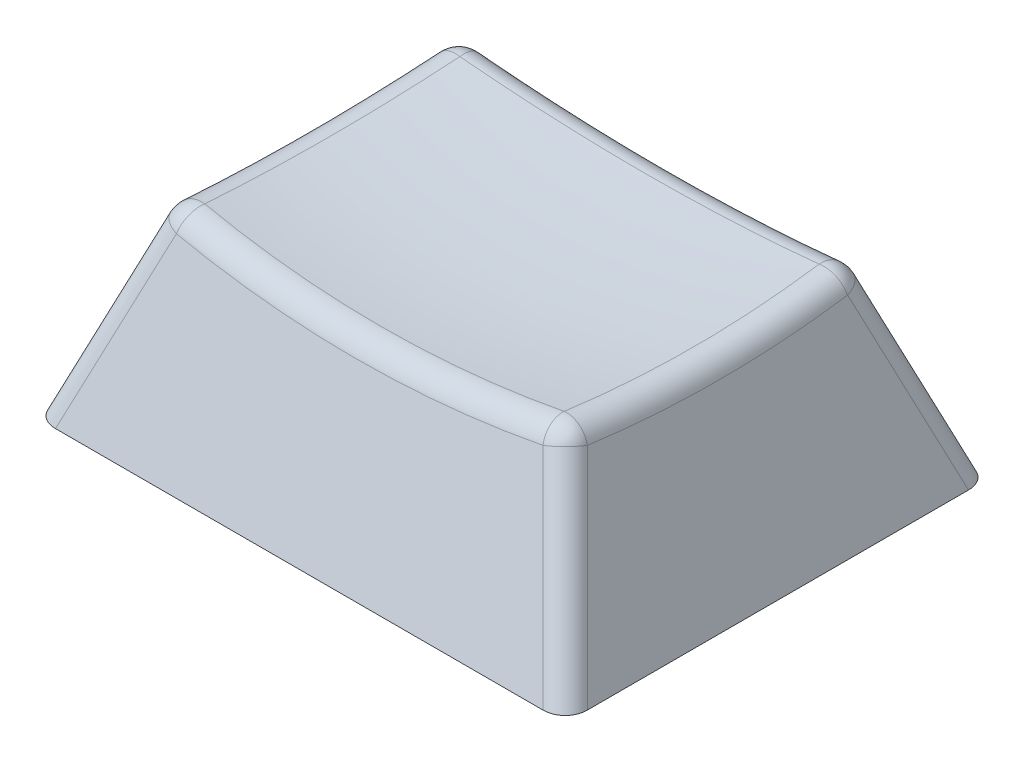
ISO-10303-21;
HEADER;
FILE_DESCRIPTION(('STEP AP214'),'2;1');
FILE_NAME('part.step','',(''),(''),'','','');
FILE_SCHEMA(('AUTOMOTIVE_DESIGN { 1 0 10303 214 1 1 1 1 }'));
ENDSEC;
DATA;
#1=APPLICATION_CONTEXT('core data for automotive mechanical design processes');
#2=APPLICATION_PROTOCOL_DEFINITION('international standard','automotive_design',2000,#1);
#3=PRODUCT_CONTEXT('',#1,'mechanical');
#4=PRODUCT('Part','Part','',(#3));
#5=PRODUCT_RELATED_PRODUCT_CATEGORY('part','',(#4));
#6=PRODUCT_DEFINITION_FORMATION('','',#4);
#7=PRODUCT_DEFINITION_CONTEXT('part definition',#1,'design');
#8=PRODUCT_DEFINITION('design','',#6,#7);
#9=PRODUCT_DEFINITION_SHAPE('','',#8);
#10=(LENGTH_UNIT() NAMED_UNIT(*) SI_UNIT(.MILLI.,.METRE.));
#11=(NAMED_UNIT(*) PLANE_ANGLE_UNIT() SI_UNIT($,.RADIAN.));
#12=(NAMED_UNIT(*) SI_UNIT($,.STERADIAN.) SOLID_ANGLE_UNIT());
#13=UNCERTAINTY_MEASURE_WITH_UNIT(LENGTH_MEASURE(1.E-05),#10,'distance_accuracy_value','');
#14=(GEOMETRIC_REPRESENTATION_CONTEXT(3) GLOBAL_UNCERTAINTY_ASSIGNED_CONTEXT((#13)) GLOBAL_UNIT_ASSIGNED_CONTEXT((#10,
#11,#12)) REPRESENTATION_CONTEXT('',''));
#15=CARTESIAN_POINT('',(0.,0.,0.));
#16=DIRECTION('',(0.,0.,1.));
#17=DIRECTION('',(1.,0.,0.));
#18=AXIS2_PLACEMENT_3D('',#15,#16,#17);
#19=CARTESIAN_POINT('',(-11.25,0.,9.));
#20=DIRECTION('',(-0.941470544812038,0.337095258423083,0.));
#21=DIRECTION('',(-0.337095258423083,-0.941470544812038,0.));
#22=AXIS2_PLACEMENT_3D('',#19,#20,#21);
#23=PLANE('',#22);
#24=DIRECTION('',(0.,0.,1.));
#25=VECTOR('',#24,1.);
#26=CARTESIAN_POINT('',(-11.25,0.,9.));
#27=LINE('',#26,#25);
#28=CARTESIAN_POINT('',(-11.25,0.,-8.05852945518796));
#29=VERTEX_POINT('',#28);
#30=CARTESIAN_POINT('',(-11.25,0.,8.05852945518796));
#31=VERTEX_POINT('',#30);
#32=EDGE_CURVE('E265',#29,#31,#27,.T.);
#33=ORIENTED_EDGE('',*,*,#32,.T.);
#34=DIRECTION('',(0.31943430634042,0.892145418564502,-0.31943430634042));
#35=VECTOR('',#34,1.);
#36=CARTESIAN_POINT('',(-11.3460660313607,-0.268302020343255,8.15459548654862));
#37=LINE('',#36,#35);
#38=CARTESIAN_POINT('',(-8.6937308781981,7.1393827787648,5.50226033338606));
#39=VERTEX_POINT('',#38);
#40=EDGE_CURVE('E297',#31,#39,#37,.T.);
#41=ORIENTED_EDGE('',*,*,#40,.T.);
#42=CARTESIAN_POINT('',(8.08913871573148,54.0121197434456,0.));
#43=DIRECTION('',(-0.941470544812038,0.337095258423083,0.));
#44=DIRECTION('',(-0.337095258423083,-0.941470544812038,0.));
#45=AXIS2_PLACEMENT_3D('',#42,#43,#44);
#46=CIRCLE('',#45,50.089849781601);
#47=CARTESIAN_POINT('',(-8.6937308781981,7.1393827787648,-5.50226033338606));
#48=VERTEX_POINT('',#47);
#49=EDGE_CURVE('E293',#39,#48,#46,.F.);
#50=ORIENTED_EDGE('',*,*,#49,.T.);
#51=DIRECTION('',(0.31943430634042,0.892145418564502,0.31943430634042));
#52=VECTOR('',#51,1.);
#53=CARTESIAN_POINT('',(-9.50937706215132,4.86137133246757,-6.31790651733928));
#54=LINE('',#53,#52);
#55=EDGE_CURVE('E295',#48,#29,#54,.F.);
#56=ORIENTED_EDGE('',*,*,#55,.T.);
#57=EDGE_LOOP('',(#33,#41,#50,#56));
#58=FACE_BOUND('',#57,.T.);
#59=ADVANCED_FACE('F35',(#58),#23,.T.);
#60=CARTESIAN_POINT('',(11.25,0.,9.));
#61=DIRECTION('',(0.,0.337095258423083,0.941470544812038));
#62=DIRECTION('',(0.,-0.941470544812038,0.337095258423083));
#63=AXIS2_PLACEMENT_3D('',#60,#61,#62);
#64=PLANE('',#63);
#65=CARTESIAN_POINT('',(0.,53.2980479160931,-10.083463985916));
#66=DIRECTION('',(0.,0.337095258423083,0.941470544812038));
#67=DIRECTION('',(0.,-0.941470544812038,0.337095258423083));
#68=AXIS2_PLACEMENT_3D('',#65,#66,#67);
#69=CIRCLE('',#68,49.6373657400651);
#70=CARTESIAN_POINT('',(7.75226033338606,7.13938277876481,6.44373087819809));
#71=VERTEX_POINT('',#70);
#72=CARTESIAN_POINT('',(-7.75226033338606,7.13938277876481,6.44373087819809));
#73=VERTEX_POINT('',#72);
#74=EDGE_CURVE('E280',#71,#73,#69,.F.);
#75=ORIENTED_EDGE('',*,*,#74,.T.);
#76=DIRECTION('',(0.319434306340419,0.892145418564502,-0.31943430634042));
#77=VECTOR('',#76,1.);
#78=CARTESIAN_POINT('',(-8.10873427503696,6.14378967067028,6.80020481984899));
#79=LINE('',#78,#77);
#80=CARTESIAN_POINT('',(-10.308529455188,0.,9.));
#81=VERTEX_POINT('',#80);
#82=EDGE_CURVE('E282',#73,#81,#79,.F.);
#83=ORIENTED_EDGE('',*,*,#82,.T.);
#84=DIRECTION('',(1.,0.,0.));
#85=VECTOR('',#84,1.);
#86=CARTESIAN_POINT('',(11.25,0.,9.));
#87=LINE('',#86,#85);
#88=CARTESIAN_POINT('',(10.308529455188,0.,9.));
#89=VERTEX_POINT('',#88);
#90=EDGE_CURVE('E268',#81,#89,#87,.T.);
#91=ORIENTED_EDGE('',*,*,#90,.T.);
#92=DIRECTION('',(-0.319434306340419,0.892145418564502,-0.319434306340419));
#93=VECTOR('',#92,1.);
#94=CARTESIAN_POINT('',(10.4045954865486,-0.268302020343255,9.09606603136065));
#95=LINE('',#94,#93);
#96=EDGE_CURVE('E278',#89,#71,#95,.T.);
#97=ORIENTED_EDGE('',*,*,#96,.T.);
#98=EDGE_LOOP('',(#75,#83,#91,#97));
#99=FACE_BOUND('',#98,.T.);
#100=ADVANCED_FACE('F388',(#99),#64,.T.);
#101=CARTESIAN_POINT('',(11.25,0.,9.));
#102=DIRECTION('',(0.941470544812038,0.337095258423083,0.));
#103=DIRECTION('',(-0.337095258423083,0.941470544812038,0.));
#104=AXIS2_PLACEMENT_3D('',#101,#102,#103);
#105=PLANE('',#104);
#106=CARTESIAN_POINT('',(-8.08913871573148,54.0121197434456,0.));
#107=DIRECTION('',(0.941470544812038,0.337095258423083,0.));
#108=DIRECTION('',(-0.337095258423083,0.941470544812038,0.));
#109=AXIS2_PLACEMENT_3D('',#106,#107,#108);
#110=CIRCLE('',#109,50.089849781601);
#111=CARTESIAN_POINT('',(8.69373087819809,7.1393827787648,-5.50226033338606));
#112=VERTEX_POINT('',#111);
#113=CARTESIAN_POINT('',(8.69373087819809,7.13938277876481,5.50226033338606));
#114=VERTEX_POINT('',#113);
#115=EDGE_CURVE('E316',#112,#114,#110,.F.);
#116=ORIENTED_EDGE('',*,*,#115,.T.);
#117=DIRECTION('',(-0.31943430634042,0.892145418564502,-0.31943430634042));
#118=VECTOR('',#117,1.);
#119=CARTESIAN_POINT('',(11.3460660313607,-0.268302020343255,8.15459548654862));
#120=LINE('',#119,#118);
#121=CARTESIAN_POINT('',(11.25,0.,8.05852945518796));
#122=VERTEX_POINT('',#121);
#123=EDGE_CURVE('E218',#114,#122,#120,.F.);
#124=ORIENTED_EDGE('',*,*,#123,.T.);
#125=DIRECTION('',(0.,0.,-1.));
#126=VECTOR('',#125,1.);
#127=CARTESIAN_POINT('',(11.25,0.,9.));
#128=LINE('',#127,#126);
#129=CARTESIAN_POINT('',(11.25,0.,-8.05852945518797));
#130=VERTEX_POINT('',#129);
#131=EDGE_CURVE('E272',#122,#130,#128,.T.);
#132=ORIENTED_EDGE('',*,*,#131,.T.);
#133=DIRECTION('',(-0.31943430634042,0.892145418564502,0.31943430634042));
#134=VECTOR('',#133,1.);
#135=CARTESIAN_POINT('',(9.50937706215132,4.86137133246757,-6.31790651733929));
#136=LINE('',#135,#134);
#137=EDGE_CURVE('E314',#130,#112,#136,.T.);
#138=ORIENTED_EDGE('',*,*,#137,.T.);
#139=EDGE_LOOP('',(#116,#124,#132,#138));
#140=FACE_BOUND('',#139,.T.);
#141=ADVANCED_FACE('F376',(#140),#105,.T.);
#142=CARTESIAN_POINT('',(11.25,0.,-9.));
#143=DIRECTION('',(0.,0.337095258423083,-0.941470544812038));
#144=DIRECTION('',(0.,0.941470544812038,0.337095258423083));
#145=AXIS2_PLACEMENT_3D('',#142,#143,#144);
#146=PLANE('',#145);
#147=DIRECTION('',(-1.,0.,0.));
#148=VECTOR('',#147,1.);
#149=CARTESIAN_POINT('',(11.25,0.,-9.));
#150=LINE('',#149,#148);
#151=CARTESIAN_POINT('',(10.308529455188,0.,-9.));
#152=VERTEX_POINT('',#151);
#153=CARTESIAN_POINT('',(-10.308529455188,0.,-9.));
#154=VERTEX_POINT('',#153);
#155=EDGE_CURVE('E275',#152,#154,#150,.T.);
#156=ORIENTED_EDGE('',*,*,#155,.T.);
#157=DIRECTION('',(0.319434306340419,0.892145418564502,0.319434306340419));
#158=VECTOR('',#157,1.);
#159=CARTESIAN_POINT('',(-8.10873427503696,6.14378967067028,-6.80020481984899));
#160=LINE('',#159,#158);
#161=CARTESIAN_POINT('',(-7.75226033338606,7.1393827787648,-6.4437308781981));
#162=VERTEX_POINT('',#161);
#163=EDGE_CURVE('E303',#154,#162,#160,.T.);
#164=ORIENTED_EDGE('',*,*,#163,.T.);
#165=CARTESIAN_POINT('',(0.,53.2980479160931,10.083463985916));
#166=DIRECTION('',(0.,0.337095258423083,-0.941470544812038));
#167=DIRECTION('',(0.,0.941470544812038,0.337095258423083));
#168=AXIS2_PLACEMENT_3D('',#165,#166,#167);
#169=CIRCLE('',#168,49.6373657400651);
#170=CARTESIAN_POINT('',(7.75226033338606,7.1393827787648,-6.4437308781981));
#171=VERTEX_POINT('',#170);
#172=EDGE_CURVE('E301',#162,#171,#169,.F.);
#173=ORIENTED_EDGE('',*,*,#172,.T.);
#174=DIRECTION('',(-0.319434306340419,0.892145418564502,0.31943430634042));
#175=VECTOR('',#174,1.);
#176=CARTESIAN_POINT('',(10.4045954865486,-0.268302020343255,-9.09606603136065));
#177=LINE('',#176,#175);
#178=EDGE_CURVE('E299',#171,#152,#177,.F.);
#179=ORIENTED_EDGE('',*,*,#178,.T.);
#180=EDGE_LOOP('',(#156,#164,#173,#179));
#181=FACE_BOUND('',#180,.T.);
#182=ADVANCED_FACE('F431',(#181),#146,.T.);
#183=CARTESIAN_POINT('',(0.,0.,0.));
#184=DIRECTION('',(0.,1.,0.));
#185=DIRECTION('',(0.,0.,1.));
#186=AXIS2_PLACEMENT_3D('',#183,#184,#185);
#187=PLANE('',#186);
#188=DIRECTION('',(0.,0.,-1.));
#189=VECTOR('',#188,1.);
#190=CARTESIAN_POINT('',(-9.65674781779873,0.,9.));
#191=LINE('',#190,#189);
#192=CARTESIAN_POINT('',(-9.65674781779873,0.,-7.40674781779872));
#193=VERTEX_POINT('',#192);
#194=CARTESIAN_POINT('',(-9.65674781779873,0.,7.40674781779873));
#195=VERTEX_POINT('',#194);
#196=EDGE_CURVE('E243',#193,#195,#191,.F.);
#197=ORIENTED_EDGE('',*,*,#196,.T.);
#198=DIRECTION('',(-1.,0.,0.));
#199=VECTOR('',#198,1.);
#200=CARTESIAN_POINT('',(11.25,0.,7.40674781779872));
#201=LINE('',#200,#199);
#202=CARTESIAN_POINT('',(9.65674781779873,0.,7.40674781779872));
#203=VERTEX_POINT('',#202);
#204=EDGE_CURVE('E257',#195,#203,#201,.F.);
#205=ORIENTED_EDGE('',*,*,#204,.T.);
#206=DIRECTION('',(0.,0.,1.));
#207=VECTOR('',#206,1.);
#208=CARTESIAN_POINT('',(9.65674781779873,0.,9.));
#209=LINE('',#208,#207);
#210=CARTESIAN_POINT('',(9.65674781779873,0.,-7.40674781779873));
#211=VERTEX_POINT('',#210);
#212=EDGE_CURVE('E260',#203,#211,#209,.F.);
#213=ORIENTED_EDGE('',*,*,#212,.T.);
#214=DIRECTION('',(1.,0.,0.));
#215=VECTOR('',#214,1.);
#216=CARTESIAN_POINT('',(11.25,0.,-7.40674781779873));
#217=LINE('',#216,#215);
#218=EDGE_CURVE('E250',#211,#193,#217,.F.);
#219=ORIENTED_EDGE('',*,*,#218,.T.);
#220=EDGE_LOOP('',(#197,#205,#213,#219));
#221=FACE_BOUND('',#220,.T.);
#222=ORIENTED_EDGE('',*,*,#90,.F.);
#223=CARTESIAN_POINT('',(-10.1878318785325,0.,7.93783187853249));
#224=DIRECTION('',(0.,1.,0.));
#225=DIRECTION('',(-0.707106781186547,0.,0.707106781186548));
#226=AXIS2_PLACEMENT_3D('',#223,#224,#225);
#227=ELLIPSE('',#226,1.12089349918878,1.);
#228=EDGE_CURVE('E291',#81,#31,#227,.F.);
#229=ORIENTED_EDGE('',*,*,#228,.T.);
#230=ORIENTED_EDGE('',*,*,#32,.F.);
#231=CARTESIAN_POINT('',(-10.1878318785325,0.,-7.93783187853248));
#232=DIRECTION('',(0.,1.,0.));
#233=DIRECTION('',(-0.707106781186548,0.,-0.707106781186548));
#234=AXIS2_PLACEMENT_3D('',#231,#232,#233);
#235=ELLIPSE('',#234,1.12089349918878,1.);
#236=EDGE_CURVE('E289',#29,#154,#235,.F.);
#237=ORIENTED_EDGE('',*,*,#236,.T.);
#238=ORIENTED_EDGE('',*,*,#155,.F.);
#239=CARTESIAN_POINT('',(10.1878318785325,0.,-7.93783187853249));
#240=DIRECTION('',(0.,1.,0.));
#241=DIRECTION('',(0.707106781186547,0.,-0.707106781186548));
#242=AXIS2_PLACEMENT_3D('',#239,#240,#241);
#243=ELLIPSE('',#242,1.12089349918878,1.);
#244=EDGE_CURVE('E285',#152,#130,#243,.F.);
#245=ORIENTED_EDGE('',*,*,#244,.T.);
#246=ORIENTED_EDGE('',*,*,#131,.F.);
#247=CARTESIAN_POINT('',(10.1878318785325,0.,7.93783187853248));
#248=DIRECTION('',(0.,1.,0.));
#249=DIRECTION('',(0.707106781186548,0.,0.707106781186548));
#250=AXIS2_PLACEMENT_3D('',#247,#248,#249);
#251=ELLIPSE('',#250,1.12089349918878,1.);
#252=EDGE_CURVE('E287',#122,#89,#251,.F.);
#253=ORIENTED_EDGE('',*,*,#252,.T.);
#254=EDGE_LOOP('',(#222,#229,#230,#237,#238,#245,#246,#253));
#255=FACE_BOUND('',#254,.T.);
#256=ADVANCED_FACE('F386',(#221,#255),#187,.F.);
#257=CARTESIAN_POINT('',(0.,56.9084507235551,0.));
#258=DIRECTION('',(0.807039903101982,0.,0.590496904988624));
#259=DIRECTION('',(0.,-1.,0.));
#260=AXIS2_PLACEMENT_3D('',#257,#258,#259);
#261=SPHERICAL_SURFACE('',#260,50.);
#262=CARTESIAN_POINT('',(0.,53.0383545805305,10.808759343851));
#263=DIRECTION('',(0.,0.337095258423083,-0.941470544812038));
#264=DIRECTION('',(0.,0.941470544812038,0.337095258423083));
#265=AXIS2_PLACEMENT_3D('',#262,#263,#264);
#266=CIRCLE('',#265,48.6640840588874);
#267=CARTESIAN_POINT('',(7.60025522880986,7.78476130864002,-5.39437287586869));
#268=VERTEX_POINT('',#267);
#269=CARTESIAN_POINT('',(-7.60025522880986,7.78476130864002,-5.39437287586868));
#270=VERTEX_POINT('',#269);
#271=EDGE_CURVE('E305',#268,#270,#266,.T.);
#272=ORIENTED_EDGE('',*,*,#271,.T.);
#273=CARTESIAN_POINT('',(8.85353849072895,53.7384249995036,0.));
#274=DIRECTION('',(-0.941470544812038,0.337095258423083,0.));
#275=DIRECTION('',(-0.337095258423083,-0.941470544812038,0.));
#276=AXIS2_PLACEMENT_3D('',#273,#274,#275);
#277=CIRCLE('',#276,49.1076958643147);
#278=CARTESIAN_POINT('',(-7.60025522880986,7.78476130864002,5.39437287586868));
#279=VERTEX_POINT('',#278);
#280=EDGE_CURVE('E311',#270,#279,#277,.T.);
#281=ORIENTED_EDGE('',*,*,#280,.T.);
#282=CARTESIAN_POINT('',(0.,53.0383545805305,-10.808759343851));
#283=DIRECTION('',(0.,0.337095258423083,0.941470544812038));
#284=DIRECTION('',(0.,-0.941470544812038,0.337095258423083));
#285=AXIS2_PLACEMENT_3D('',#282,#283,#284);
#286=CIRCLE('',#285,48.6640840588874);
#287=CARTESIAN_POINT('',(7.60025522880986,7.78476130864002,5.39437287586868));
#288=VERTEX_POINT('',#287);
#289=EDGE_CURVE('E309',#279,#288,#286,.T.);
#290=ORIENTED_EDGE('',*,*,#289,.T.);
#291=CARTESIAN_POINT('',(-8.85353849072895,53.7384249995036,0.));
#292=DIRECTION('',(0.941470544812038,0.337095258423083,0.));
#293=DIRECTION('',(-0.337095258423083,0.941470544812038,0.));
#294=AXIS2_PLACEMENT_3D('',#291,#292,#293);
#295=CIRCLE('',#294,49.1076958643147);
#296=EDGE_CURVE('E307',#288,#268,#295,.T.);
#297=ORIENTED_EDGE('',*,*,#296,.T.);
#298=EDGE_LOOP('',(#272,#281,#290,#297));
#299=FACE_BOUND('',#298,.T.);
#300=ADVANCED_FACE('F367',(#299),#261,.F.);
#301=CARTESIAN_POINT('',(10.4045954865486,-0.605397278766338,-8.15459548654862));
#302=DIRECTION('',(0.31943430634042,-0.892145418564502,-0.31943430634042));
#303=DIRECTION('',(0.,0.337095258423083,-0.941470544812038));
#304=AXIS2_PLACEMENT_3D('',#301,#302,#303);
#305=CYLINDRICAL_SURFACE('',#304,1.);
#306=CARTESIAN_POINT('',(7.75226033338606,6.80228752034172,-5.50226033338606));
#307=DIRECTION('',(-0.319434306340421,0.892145418564503,0.319434306340413));
#308=DIRECTION('',(-0.941470544812038,-0.337095258423083,0.));
#309=AXIS2_PLACEMENT_3D('',#306,#307,#308);
#310=CIRCLE('',#309,1.);
#311=EDGE_CURVE('E269',#112,#171,#310,.T.);
#312=ORIENTED_EDGE('',*,*,#311,.F.);
#313=ORIENTED_EDGE('',*,*,#137,.F.);
#314=ORIENTED_EDGE('',*,*,#244,.F.);
#315=ORIENTED_EDGE('',*,*,#178,.F.);
#316=EDGE_LOOP('',(#312,#313,#314,#315));
#317=FACE_BOUND('',#316,.T.);
#318=ADVANCED_FACE('F37',(#317),#305,.T.);
#319=CARTESIAN_POINT('',(7.75226033338606,6.80228752034172,-5.50226033338606));
#320=DIRECTION('',(0.,0.,1.));
#321=DIRECTION('',(1.,0.,0.));
#322=AXIS2_PLACEMENT_3D('',#319,#320,#321);
#323=SPHERICAL_SURFACE('',#322,1.);
#324=CARTESIAN_POINT('',(7.75226033338606,6.80228752034172,-5.50226033338606));
#325=DIRECTION('',(-0.037029176112145,0.103418478121958,-0.993948418429948));
#326=DIRECTION('',(0.,0.994630551093696,0.103489452752687));
#327=AXIS2_PLACEMENT_3D('',#324,#325,#326);
#328=CIRCLE('',#327,1.);
#329=EDGE_CURVE('E344',#112,#268,#328,.F.);
#330=ORIENTED_EDGE('',*,*,#329,.F.);
#331=ORIENTED_EDGE('',*,*,#311,.T.);
#332=CARTESIAN_POINT('',(7.75226033338606,6.80228752034172,-5.50226033338606));
#333=DIRECTION('',(0.987728939829506,0.147036907595335,0.052646834929367));
#334=DIRECTION('',(-0.147241102473528,0.989100630746124,0.));
#335=AXIS2_PLACEMENT_3D('',#332,#333,#334);
#336=CIRCLE('',#335,1.);
#337=EDGE_CURVE('E347',#268,#171,#336,.F.);
#338=ORIENTED_EDGE('',*,*,#337,.F.);
#339=EDGE_LOOP('',(#330,#331,#338));
#340=FACE_BOUND('',#339,.T.);
#341=ADVANCED_FACE('F354',(#340),#323,.T.);
#342=CARTESIAN_POINT('',(-8.56790651733929,4.52427607404449,-6.31790651733929));
#343=DIRECTION('',(-0.31943430634042,-0.892145418564502,-0.31943430634042));
#344=DIRECTION('',(0.,0.337095258423083,-0.941470544812038));
#345=AXIS2_PLACEMENT_3D('',#342,#343,#344);
#346=CYLINDRICAL_SURFACE('',#345,1.);
#347=ORIENTED_EDGE('',*,*,#236,.F.);
#348=ORIENTED_EDGE('',*,*,#55,.F.);
#349=CARTESIAN_POINT('',(-7.75226033338606,6.80228752034172,-5.50226033338606));
#350=DIRECTION('',(0.31943430634042,0.892145418564501,0.31943430634042));
#351=DIRECTION('',(-0.941470544812037,0.337095258423084,0.));
#352=AXIS2_PLACEMENT_3D('',#349,#350,#351);
#353=CIRCLE('',#352,1.);
#354=EDGE_CURVE('E341',#162,#48,#353,.T.);
#355=ORIENTED_EDGE('',*,*,#354,.F.);
#356=ORIENTED_EDGE('',*,*,#163,.F.);
#357=EDGE_LOOP('',(#347,#348,#355,#356));
#358=FACE_BOUND('',#357,.T.);
#359=ADVANCED_FACE('F402',(#358),#346,.T.);
#360=CARTESIAN_POINT('',(0.,52.96095265767,11.024934530728));
#361=DIRECTION('',(0.,0.337095258423083,-0.941470544812038));
#362=DIRECTION('',(0.,0.941470544812038,0.337095258423083));
#363=AXIS2_PLACEMENT_3D('',#360,#361,#362);
#364=TOROIDAL_SURFACE('',#363,49.6373657400651,1.);
#365=ORIENTED_EDGE('',*,*,#337,.T.);
#366=ORIENTED_EDGE('',*,*,#172,.F.);
#367=CARTESIAN_POINT('',(-7.75226033338606,6.80228752034172,-5.50226033338605));
#368=DIRECTION('',(-0.987728939829507,0.147036907595333,0.0526468349293673));
#369=DIRECTION('',(-0.147241102473526,-0.989100630746124,0.));
#370=AXIS2_PLACEMENT_3D('',#367,#368,#369);
#371=CIRCLE('',#370,1.);
#372=EDGE_CURVE('E338',#270,#162,#371,.T.);
#373=ORIENTED_EDGE('',*,*,#372,.F.);
#374=ORIENTED_EDGE('',*,*,#271,.F.);
#375=EDGE_LOOP('',(#365,#366,#373,#374));
#376=FACE_BOUND('',#375,.T.);
#377=ADVANCED_FACE('F362',(#376),#364,.T.);
#378=CARTESIAN_POINT('',(-9.03060926054352,53.6750244850225,0.));
#379=DIRECTION('',(0.941470544812038,0.337095258423083,0.));
#380=DIRECTION('',(-0.337095258423083,0.941470544812038,0.));
#381=AXIS2_PLACEMENT_3D('',#378,#379,#380);
#382=TOROIDAL_SURFACE('',#381,50.089849781601,1.);
#383=ORIENTED_EDGE('',*,*,#329,.T.);
#384=ORIENTED_EDGE('',*,*,#296,.F.);
#385=CARTESIAN_POINT('',(7.75226033338606,6.80228752034172,5.50226033338606));
#386=DIRECTION('',(-0.0370291761121483,0.103418478121963,0.993948418429947));
#387=DIRECTION('',(0.,-0.994630551093695,0.103489452752693));
#388=AXIS2_PLACEMENT_3D('',#385,#386,#387);
#389=CIRCLE('',#388,1.);
#390=EDGE_CURVE('E335',#114,#288,#389,.T.);
#391=ORIENTED_EDGE('',*,*,#390,.F.);
#392=ORIENTED_EDGE('',*,*,#115,.F.);
#393=EDGE_LOOP('',(#383,#384,#391,#392));
#394=FACE_BOUND('',#393,.T.);
#395=ADVANCED_FACE('F373',(#394),#382,.T.);
#396=CARTESIAN_POINT('',(10.4045954865486,-0.605397278766338,8.15459548654862));
#397=DIRECTION('',(0.31943430634042,-0.892145418564502,0.31943430634042));
#398=DIRECTION('',(0.,-0.337095258423083,-0.941470544812038));
#399=AXIS2_PLACEMENT_3D('',#396,#397,#398);
#400=CYLINDRICAL_SURFACE('',#399,1.);
#401=ORIENTED_EDGE('',*,*,#252,.F.);
#402=ORIENTED_EDGE('',*,*,#123,.F.);
#403=CARTESIAN_POINT('',(7.75226033338606,6.80228752034172,5.50226033338605));
#404=DIRECTION('',(-0.319434306340411,0.892145418564504,-0.319434306340421));
#405=DIRECTION('',(0.,0.337095258423083,0.941470544812038));
#406=AXIS2_PLACEMENT_3D('',#403,#404,#405);
#407=CIRCLE('',#406,1.);
#408=EDGE_CURVE('E332',#71,#114,#407,.T.);
#409=ORIENTED_EDGE('',*,*,#408,.F.);
#410=ORIENTED_EDGE('',*,*,#96,.F.);
#411=EDGE_LOOP('',(#401,#402,#409,#410));
#412=FACE_BOUND('',#411,.T.);
#413=ADVANCED_FACE('F381',(#412),#400,.T.);
#414=CARTESIAN_POINT('',(-7.75226033338606,6.80228752034172,-5.50226033338606));
#415=DIRECTION('',(0.,0.,1.));
#416=DIRECTION('',(1.,0.,0.));
#417=AXIS2_PLACEMENT_3D('',#414,#415,#416);
#418=SPHERICAL_SURFACE('',#417,1.);
#419=ORIENTED_EDGE('',*,*,#372,.T.);
#420=ORIENTED_EDGE('',*,*,#354,.T.);
#421=CARTESIAN_POINT('',(-7.75226033338606,6.80228752034172,-5.50226033338606));
#422=DIRECTION('',(0.0370291761121468,0.103418478121959,-0.993948418429947));
#423=DIRECTION('',(0.,0.994630551093696,0.103489452752688));
#424=AXIS2_PLACEMENT_3D('',#421,#422,#423);
#425=CIRCLE('',#424,1.);
#426=EDGE_CURVE('E329',#270,#48,#425,.F.);
#427=ORIENTED_EDGE('',*,*,#426,.F.);
#428=EDGE_LOOP('',(#419,#420,#427));
#429=FACE_BOUND('',#428,.T.);
#430=ADVANCED_FACE('F405',(#429),#418,.T.);
#431=CARTESIAN_POINT('',(7.75226033338606,6.80228752034172,5.50226033338606));
#432=DIRECTION('',(0.,0.,1.));
#433=DIRECTION('',(1.,0.,0.));
#434=AXIS2_PLACEMENT_3D('',#431,#432,#433);
#435=SPHERICAL_SURFACE('',#434,1.);
#436=ORIENTED_EDGE('',*,*,#408,.T.);
#437=ORIENTED_EDGE('',*,*,#390,.T.);
#438=CARTESIAN_POINT('',(7.75226033338606,6.80228752034172,5.50226033338605));
#439=DIRECTION('',(0.987728939829507,0.147036907595333,-0.0526468349293662));
#440=DIRECTION('',(-0.147241102473526,0.989100630746124,0.));
#441=AXIS2_PLACEMENT_3D('',#438,#439,#440);
#442=CIRCLE('',#441,1.);
#443=EDGE_CURVE('E326',#71,#288,#442,.F.);
#444=ORIENTED_EDGE('',*,*,#443,.F.);
#445=EDGE_LOOP('',(#436,#437,#444));
#446=FACE_BOUND('',#445,.T.);
#447=ADVANCED_FACE('F413',(#446),#435,.T.);
#448=CARTESIAN_POINT('',(9.03060926054352,53.6750244850225,0.));
#449=DIRECTION('',(-0.941470544812038,0.337095258423083,0.));
#450=DIRECTION('',(-0.337095258423083,-0.941470544812038,0.));
#451=AXIS2_PLACEMENT_3D('',#448,#449,#450);
#452=TOROIDAL_SURFACE('',#451,50.089849781601,1.);
#453=ORIENTED_EDGE('',*,*,#426,.T.);
#454=ORIENTED_EDGE('',*,*,#49,.F.);
#455=CARTESIAN_POINT('',(-7.75226033338605,6.80228752034172,5.50226033338606));
#456=DIRECTION('',(0.0370291761121496,0.103418478121957,0.993948418429947));
#457=DIRECTION('',(0.,-0.994630551093696,0.103489452752686));
#458=AXIS2_PLACEMENT_3D('',#455,#456,#457);
#459=CIRCLE('',#458,1.);
#460=EDGE_CURVE('E323',#279,#39,#459,.T.);
#461=ORIENTED_EDGE('',*,*,#460,.F.);
#462=ORIENTED_EDGE('',*,*,#280,.F.);
#463=EDGE_LOOP('',(#453,#454,#461,#462));
#464=FACE_BOUND('',#463,.T.);
#465=ADVANCED_FACE('F407',(#464),#452,.T.);
#466=CARTESIAN_POINT('',(0.,52.96095265767,-11.024934530728));
#467=DIRECTION('',(0.,0.337095258423083,0.941470544812038));
#468=DIRECTION('',(0.,-0.941470544812038,0.337095258423083));
#469=AXIS2_PLACEMENT_3D('',#466,#467,#468);
#470=TOROIDAL_SURFACE('',#469,49.6373657400651,1.);
#471=ORIENTED_EDGE('',*,*,#443,.T.);
#472=ORIENTED_EDGE('',*,*,#289,.F.);
#473=CARTESIAN_POINT('',(-7.75226033338606,6.80228752034172,5.50226033338606));
#474=DIRECTION('',(-0.987728939829506,0.14703690759534,-0.0526468349293688));
#475=DIRECTION('',(-0.147241102473533,-0.989100630746123,0.));
#476=AXIS2_PLACEMENT_3D('',#473,#474,#475);
#477=CIRCLE('',#476,1.);
#478=EDGE_CURVE('E321',#73,#279,#477,.T.);
#479=ORIENTED_EDGE('',*,*,#478,.F.);
#480=ORIENTED_EDGE('',*,*,#74,.F.);
#481=EDGE_LOOP('',(#471,#472,#479,#480));
#482=FACE_BOUND('',#481,.T.);
#483=ADVANCED_FACE('F411',(#482),#470,.T.);
#484=CARTESIAN_POINT('',(-7.75226033338606,6.80228752034172,5.50226033338606));
#485=DIRECTION('',(0.,0.,1.));
#486=DIRECTION('',(1.,0.,0.));
#487=AXIS2_PLACEMENT_3D('',#484,#485,#486);
#488=SPHERICAL_SURFACE('',#487,1.);
#489=ORIENTED_EDGE('',*,*,#478,.T.);
#490=ORIENTED_EDGE('',*,*,#460,.T.);
#491=CARTESIAN_POINT('',(-7.75226033338606,6.80228752034171,5.50226033338606));
#492=DIRECTION('',(0.319434306340419,0.8921454185645,-0.319434306340425));
#493=DIRECTION('',(0.,0.337095258423089,0.941470544812036));
#494=AXIS2_PLACEMENT_3D('',#491,#492,#493);
#495=CIRCLE('',#494,1.);
#496=EDGE_CURVE('E253',#73,#39,#495,.F.);
#497=ORIENTED_EDGE('',*,*,#496,.F.);
#498=EDGE_LOOP('',(#489,#490,#497));
#499=FACE_BOUND('',#498,.T.);
#500=ADVANCED_FACE('F440',(#499),#488,.T.);
#501=CARTESIAN_POINT('',(-8.10873427503696,5.8066944122472,5.85873427503695));
#502=DIRECTION('',(-0.31943430634042,-0.892145418564502,0.31943430634042));
#503=DIRECTION('',(0.,-0.337095258423083,-0.941470544812038));
#504=AXIS2_PLACEMENT_3D('',#501,#502,#503);
#505=CYLINDRICAL_SURFACE('',#504,1.);
#506=ORIENTED_EDGE('',*,*,#496,.T.);
#507=ORIENTED_EDGE('',*,*,#40,.F.);
#508=ORIENTED_EDGE('',*,*,#228,.F.);
#509=ORIENTED_EDGE('',*,*,#82,.F.);
#510=EDGE_LOOP('',(#506,#507,#508,#509));
#511=FACE_BOUND('',#510,.T.);
#512=ADVANCED_FACE('F393',(#511),#505,.T.);
#513=CARTESIAN_POINT('',(-9.83779418278194,-0.505642887634624,9.));
#514=DIRECTION('',(-0.941470544812038,0.337095258423083,0.));
#515=DIRECTION('',(-0.337095258423083,-0.941470544812038,0.));
#516=AXIS2_PLACEMENT_3D('',#513,#514,#515);
#517=PLANE('',#516);
#518=DIRECTION('',(0.,0.,1.));
#519=VECTOR('',#518,1.);
#520=CARTESIAN_POINT('',(-7.95152594220574,4.7625,9.));
#521=LINE('',#520,#519);
#522=CARTESIAN_POINT('',(-7.95152594220574,4.7625,5.70152594220574));
#523=VERTEX_POINT('',#522);
#524=CARTESIAN_POINT('',(-7.95152594220574,4.7625,-5.70152594220574));
#525=VERTEX_POINT('',#524);
#526=EDGE_CURVE('E51',#523,#525,#521,.F.);
#527=ORIENTED_EDGE('',*,*,#526,.F.);
#528=DIRECTION('',(0.31943430634042,0.892145418564502,-0.31943430634042));
#529=VECTOR('',#528,1.);
#530=CARTESIAN_POINT('',(-9.98189322982292,-0.908095918149508,7.73189322982292));
#531=LINE('',#530,#529);
#532=EDGE_CURVE('E245',#195,#523,#531,.T.);
#533=ORIENTED_EDGE('',*,*,#532,.F.);
#534=ORIENTED_EDGE('',*,*,#196,.F.);
#535=DIRECTION('',(-0.31943430634042,-0.892145418564502,-0.31943430634042));
#536=VECTOR('',#535,1.);
#537=CARTESIAN_POINT('',(-8.14520426061359,4.22157743466132,-5.89520426061359));
#538=LINE('',#537,#536);
#539=EDGE_CURVE('E248',#525,#193,#538,.T.);
#540=ORIENTED_EDGE('',*,*,#539,.F.);
#541=EDGE_LOOP('',(#527,#533,#534,#540));
#542=FACE_BOUND('',#541,.T.);
#543=ADVANCED_FACE('F439',(#542),#517,.F.);
#544=CARTESIAN_POINT('',(11.25,-0.505642887634624,7.58779418278194));
#545=DIRECTION('',(0.,0.337095258423083,0.941470544812038));
#546=DIRECTION('',(0.,-0.941470544812038,0.337095258423083));
#547=AXIS2_PLACEMENT_3D('',#544,#545,#546);
#548=PLANE('',#547);
#549=DIRECTION('',(1.,0.,0.));
#550=VECTOR('',#549,1.);
#551=CARTESIAN_POINT('',(11.25,4.7625,5.70152594220574));
#552=LINE('',#551,#550);
#553=CARTESIAN_POINT('',(7.95152594220574,4.7625,5.70152594220574));
#554=VERTEX_POINT('',#553);
#555=EDGE_CURVE('E58',#554,#523,#552,.F.);
#556=ORIENTED_EDGE('',*,*,#555,.F.);
#557=DIRECTION('',(0.31943430634042,-0.892145418564502,0.31943430634042));
#558=VECTOR('',#557,1.);
#559=CARTESIAN_POINT('',(9.98189322982292,-0.908095918149508,7.73189322982292));
#560=LINE('',#559,#558);
#561=EDGE_CURVE('E251',#554,#203,#560,.T.);
#562=ORIENTED_EDGE('',*,*,#561,.T.);
#563=ORIENTED_EDGE('',*,*,#204,.F.);
#564=ORIENTED_EDGE('',*,*,#532,.T.);
#565=EDGE_LOOP('',(#556,#562,#563,#564));
#566=FACE_BOUND('',#565,.T.);
#567=ADVANCED_FACE('F463',(#566),#548,.F.);
#568=CARTESIAN_POINT('',(9.83779418278194,-0.505642887634624,9.));
#569=DIRECTION('',(0.941470544812038,0.337095258423083,0.));
#570=DIRECTION('',(-0.337095258423083,0.941470544812038,0.));
#571=AXIS2_PLACEMENT_3D('',#568,#569,#570);
#572=PLANE('',#571);
#573=DIRECTION('',(0.,0.,-1.));
#574=VECTOR('',#573,1.);
#575=CARTESIAN_POINT('',(7.95152594220574,4.7625,9.));
#576=LINE('',#575,#574);
#577=CARTESIAN_POINT('',(7.95152594220574,4.7625,-5.70152594220574));
#578=VERTEX_POINT('',#577);
#579=EDGE_CURVE('E769',#578,#554,#576,.F.);
#580=ORIENTED_EDGE('',*,*,#579,.F.);
#581=DIRECTION('',(-0.31943430634042,0.892145418564502,0.31943430634042));
#582=VECTOR('',#581,1.);
#583=CARTESIAN_POINT('',(8.14520426061359,4.22157743466132,-5.89520426061359));
#584=LINE('',#583,#582);
#585=EDGE_CURVE('E247',#211,#578,#584,.T.);
#586=ORIENTED_EDGE('',*,*,#585,.F.);
#587=ORIENTED_EDGE('',*,*,#212,.F.);
#588=ORIENTED_EDGE('',*,*,#561,.F.);
#589=EDGE_LOOP('',(#580,#586,#587,#588));
#590=FACE_BOUND('',#589,.T.);
#591=ADVANCED_FACE('F471',(#590),#572,.F.);
#592=CARTESIAN_POINT('',(11.25,-0.505642887634624,-7.58779418278194));
#593=DIRECTION('',(0.,0.337095258423083,-0.941470544812038));
#594=DIRECTION('',(0.,0.941470544812038,0.337095258423083));
#595=AXIS2_PLACEMENT_3D('',#592,#593,#594);
#596=PLANE('',#595);
#597=DIRECTION('',(-1.,0.,0.));
#598=VECTOR('',#597,1.);
#599=CARTESIAN_POINT('',(11.25,4.7625,-5.70152594220574));
#600=LINE('',#599,#598);
#601=EDGE_CURVE('E771',#525,#578,#600,.F.);
#602=ORIENTED_EDGE('',*,*,#601,.F.);
#603=ORIENTED_EDGE('',*,*,#539,.T.);
#604=ORIENTED_EDGE('',*,*,#218,.F.);
#605=ORIENTED_EDGE('',*,*,#585,.T.);
#606=EDGE_LOOP('',(#602,#603,#604,#605));
#607=FACE_BOUND('',#606,.T.);
#608=ADVANCED_FACE('F478',(#607),#596,.F.);
#609=CARTESIAN_POINT('',(0.,4.7625,0.));
#610=DIRECTION('',(0.,-1.,0.));
#611=DIRECTION('',(0.,0.,-1.));
#612=AXIS2_PLACEMENT_3D('',#609,#610,#611);
#613=PLANE('',#612);
#614=ORIENTED_EDGE('',*,*,#555,.T.);
#615=ORIENTED_EDGE('',*,*,#526,.T.);
#616=ORIENTED_EDGE('',*,*,#601,.T.);
#617=ORIENTED_EDGE('',*,*,#579,.T.);
#618=EDGE_LOOP('',(#614,#615,#616,#617));
#619=FACE_BOUND('',#618,.T.);
#620=CARTESIAN_POINT('',(0.,4.7625,0.));
#621=DIRECTION('',(0.,-1.,0.));
#622=DIRECTION('',(0.,0.,-1.));
#623=AXIS2_PLACEMENT_3D('',#620,#621,#622);
#624=CIRCLE('',#623,2.75);
#625=CARTESIAN_POINT('',(0.,4.7625,-2.75));
#626=VERTEX_POINT('',#625);
#627=EDGE_CURVE('E11',#626,#626,#624,.F.);
#628=ORIENTED_EDGE('',*,*,#627,.T.);
#629=EDGE_LOOP('',(#628));
#630=FACE_BOUND('',#629,.T.);
#631=ADVANCED_FACE('F486',(#619,#630),#613,.T.);
#632=CARTESIAN_POINT('',(0.,7.80428752034172,0.));
#633=DIRECTION('',(0.,-1.,0.));
#634=DIRECTION('',(0.,0.,-1.));
#635=AXIS2_PLACEMENT_3D('',#632,#633,#634);
#636=CYLINDRICAL_SURFACE('',#635,2.75);
#637=ORIENTED_EDGE('',*,*,#627,.F.);
#638=EDGE_LOOP('',(#637));
#639=FACE_BOUND('',#638,.T.);
#640=CARTESIAN_POINT('',(0.,0.,0.));
#641=DIRECTION('',(0.,-1.,0.));
#642=DIRECTION('',(0.,0.,-1.));
#643=AXIS2_PLACEMENT_3D('',#640,#641,#642);
#644=CIRCLE('',#643,2.75);
#645=CARTESIAN_POINT('',(0.,0.,-2.75));
#646=VERTEX_POINT('',#645);
#647=EDGE_CURVE('E240',#646,#646,#644,.T.);
#648=ORIENTED_EDGE('',*,*,#647,.F.);
#649=EDGE_LOOP('',(#648));
#650=FACE_BOUND('',#649,.T.);
#651=ADVANCED_FACE('F494',(#639,#650),#636,.T.);
#652=CARTESIAN_POINT('',(0.,0.,0.));
#653=DIRECTION('',(0.,-1.,0.));
#654=DIRECTION('',(0.,0.,-1.));
#655=AXIS2_PLACEMENT_3D('',#652,#653,#654);
#656=PLANE('',#655);
#657=DIRECTION('',(0.,0.,1.));
#658=VECTOR('',#657,1.);
#659=CARTESIAN_POINT('',(2.05,0.,0.));
#660=LINE('',#659,#658);
#661=CARTESIAN_POINT('',(2.05,0.,-0.55));
#662=VERTEX_POINT('',#661);
#663=CARTESIAN_POINT('',(2.05,0.,0.55));
#664=VERTEX_POINT('',#663);
#665=EDGE_CURVE('E236',#662,#664,#660,.T.);
#666=ORIENTED_EDGE('',*,*,#665,.F.);
#667=DIRECTION('',(1.,0.,0.));
#668=VECTOR('',#667,1.);
#669=CARTESIAN_POINT('',(2.05,0.,-0.55));
#670=LINE('',#669,#668);
#671=CARTESIAN_POINT('',(0.550000000000001,0.,-0.55));
#672=VERTEX_POINT('',#671);
#673=EDGE_CURVE('E806',#672,#662,#670,.T.);
#674=ORIENTED_EDGE('',*,*,#673,.F.);
#675=DIRECTION('',(0.,0.,1.));
#676=VECTOR('',#675,1.);
#677=CARTESIAN_POINT('',(0.550000000000001,0.,-0.55));
#678=LINE('',#677,#676);
#679=CARTESIAN_POINT('',(0.550000000000001,0.,-2.05));
#680=VERTEX_POINT('',#679);
#681=EDGE_CURVE('E803',#680,#672,#678,.T.);
#682=ORIENTED_EDGE('',*,*,#681,.F.);
#683=DIRECTION('',(1.,0.,0.));
#684=VECTOR('',#683,1.);
#685=CARTESIAN_POINT('',(0.550000000000001,0.,-2.05));
#686=LINE('',#685,#684);
#687=CARTESIAN_POINT('',(-0.55,0.,-2.05));
#688=VERTEX_POINT('',#687);
#689=EDGE_CURVE('E800',#688,#680,#686,.T.);
#690=ORIENTED_EDGE('',*,*,#689,.F.);
#691=DIRECTION('',(0.,0.,-1.));
#692=VECTOR('',#691,1.);
#693=CARTESIAN_POINT('',(-0.55,0.,-2.05));
#694=LINE('',#693,#692);
#695=CARTESIAN_POINT('',(-0.55,0.,-0.55));
#696=VERTEX_POINT('',#695);
#697=EDGE_CURVE('E797',#696,#688,#694,.T.);
#698=ORIENTED_EDGE('',*,*,#697,.F.);
#699=DIRECTION('',(1.,0.,0.));
#700=VECTOR('',#699,1.);
#701=CARTESIAN_POINT('',(-0.55,0.,-0.55));
#702=LINE('',#701,#700);
#703=CARTESIAN_POINT('',(-2.05,0.,-0.550000000000001));
#704=VERTEX_POINT('',#703);
#705=EDGE_CURVE('E794',#704,#696,#702,.T.);
#706=ORIENTED_EDGE('',*,*,#705,.F.);
#707=DIRECTION('',(0.,0.,-1.));
#708=VECTOR('',#707,1.);
#709=CARTESIAN_POINT('',(-2.05,0.,-0.550000000000001));
#710=LINE('',#709,#708);
#711=CARTESIAN_POINT('',(-2.05,0.,0.55));
#712=VERTEX_POINT('',#711);
#713=EDGE_CURVE('E791',#712,#704,#710,.T.);
#714=ORIENTED_EDGE('',*,*,#713,.F.);
#715=DIRECTION('',(-1.,0.,0.));
#716=VECTOR('',#715,1.);
#717=CARTESIAN_POINT('',(-2.05,0.,0.55));
#718=LINE('',#717,#716);
#719=CARTESIAN_POINT('',(-0.55,0.,0.55));
#720=VERTEX_POINT('',#719);
#721=EDGE_CURVE('E788',#720,#712,#718,.T.);
#722=ORIENTED_EDGE('',*,*,#721,.F.);
#723=DIRECTION('',(0.,0.,-1.));
#724=VECTOR('',#723,1.);
#725=CARTESIAN_POINT('',(-0.55,0.,0.55));
#726=LINE('',#725,#724);
#727=CARTESIAN_POINT('',(-0.55,0.,2.05));
#728=VERTEX_POINT('',#727);
#729=EDGE_CURVE('E785',#728,#720,#726,.T.);
#730=ORIENTED_EDGE('',*,*,#729,.F.);
#731=DIRECTION('',(-1.,0.,0.));
#732=VECTOR('',#731,1.);
#733=CARTESIAN_POINT('',(-0.55,0.,2.05));
#734=LINE('',#733,#732);
#735=CARTESIAN_POINT('',(0.55,0.,2.05));
#736=VERTEX_POINT('',#735);
#737=EDGE_CURVE('E782',#736,#728,#734,.T.);
#738=ORIENTED_EDGE('',*,*,#737,.F.);
#739=DIRECTION('',(0.,0.,1.));
#740=VECTOR('',#739,1.);
#741=CARTESIAN_POINT('',(0.55,0.,2.05));
#742=LINE('',#741,#740);
#743=CARTESIAN_POINT('',(0.55,0.,0.55));
#744=VERTEX_POINT('',#743);
#745=EDGE_CURVE('E780',#744,#736,#742,.T.);
#746=ORIENTED_EDGE('',*,*,#745,.F.);
#747=DIRECTION('',(-1.,0.,0.));
#748=VECTOR('',#747,1.);
#749=CARTESIAN_POINT('',(0.55,0.,0.55));
#750=LINE('',#749,#748);
#751=EDGE_CURVE('E230',#664,#744,#750,.T.);
#752=ORIENTED_EDGE('',*,*,#751,.F.);
#753=EDGE_LOOP('',(#666,#674,#682,#690,#698,#706,#714,#722,#730,#738,#746,#752));
#754=FACE_BOUND('',#753,.T.);
#755=ORIENTED_EDGE('',*,*,#647,.T.);
#756=EDGE_LOOP('',(#755));
#757=FACE_BOUND('',#756,.T.);
#758=ADVANCED_FACE('F502',(#754,#757),#656,.T.);
#759=CARTESIAN_POINT('',(0.55,7.80328752034172,0.55));
#760=DIRECTION('',(0.,0.,1.));
#761=DIRECTION('',(1.,0.,0.));
#762=AXIS2_PLACEMENT_3D('',#759,#760,#761);
#763=PLANE('',#762);
#764=DIRECTION('',(0.,-1.,0.));
#765=VECTOR('',#764,1.);
#766=CARTESIAN_POINT('',(0.55,7.80328752034172,0.55));
#767=LINE('',#766,#765);
#768=CARTESIAN_POINT('',(0.55,4.7625,0.55));
#769=VERTEX_POINT('',#768);
#770=EDGE_CURVE('E223',#769,#744,#767,.T.);
#771=ORIENTED_EDGE('',*,*,#770,.F.);
#772=DIRECTION('',(1.,0.,0.));
#773=VECTOR('',#772,1.);
#774=CARTESIAN_POINT('',(0.55,4.7625,0.55));
#775=LINE('',#774,#773);
#776=CARTESIAN_POINT('',(2.05,4.7625,0.55));
#777=VERTEX_POINT('',#776);
#778=EDGE_CURVE('E39',#769,#777,#775,.T.);
#779=ORIENTED_EDGE('',*,*,#778,.T.);
#780=DIRECTION('',(0.,-1.,0.));
#781=VECTOR('',#780,1.);
#782=CARTESIAN_POINT('',(2.05,7.80328752034172,0.55));
#783=LINE('',#782,#781);
#784=EDGE_CURVE('E232',#777,#664,#783,.T.);
#785=ORIENTED_EDGE('',*,*,#784,.T.);
#786=ORIENTED_EDGE('',*,*,#751,.T.);
#787=EDGE_LOOP('',(#771,#779,#785,#786));
#788=FACE_BOUND('',#787,.T.);
#789=ADVANCED_FACE('F228',(#788),#763,.F.);
#790=CARTESIAN_POINT('',(0.55,7.80328752034172,2.05));
#791=DIRECTION('',(1.,0.,0.));
#792=DIRECTION('',(0.,0.,-1.));
#793=AXIS2_PLACEMENT_3D('',#790,#791,#792);
#794=PLANE('',#793);
#795=DIRECTION('',(0.,-1.,0.));
#796=VECTOR('',#795,1.);
#797=CARTESIAN_POINT('',(0.55,7.80328752034172,2.05));
#798=LINE('',#797,#796);
#799=CARTESIAN_POINT('',(0.55,4.7625,2.05));
#800=VERTEX_POINT('',#799);
#801=EDGE_CURVE('E225',#800,#736,#798,.T.);
#802=ORIENTED_EDGE('',*,*,#801,.F.);
#803=DIRECTION('',(0.,0.,-1.));
#804=VECTOR('',#803,1.);
#805=CARTESIAN_POINT('',(0.55,4.7625,2.05));
#806=LINE('',#805,#804);
#807=EDGE_CURVE('E211',#800,#769,#806,.T.);
#808=ORIENTED_EDGE('',*,*,#807,.T.);
#809=ORIENTED_EDGE('',*,*,#770,.T.);
#810=ORIENTED_EDGE('',*,*,#745,.T.);
#811=EDGE_LOOP('',(#802,#808,#809,#810));
#812=FACE_BOUND('',#811,.T.);
#813=ADVANCED_FACE('F221',(#812),#794,.F.);
#814=CARTESIAN_POINT('',(-0.55,7.80328752034172,2.05));
#815=DIRECTION('',(0.,0.,1.));
#816=DIRECTION('',(1.,0.,0.));
#817=AXIS2_PLACEMENT_3D('',#814,#815,#816);
#818=PLANE('',#817);
#819=DIRECTION('',(0.,-1.,0.));
#820=VECTOR('',#819,1.);
#821=CARTESIAN_POINT('',(-0.55,7.80328752034172,2.05));
#822=LINE('',#821,#820);
#823=CARTESIAN_POINT('',(-0.55,4.7625,2.05));
#824=VERTEX_POINT('',#823);
#825=EDGE_CURVE('E234',#824,#728,#822,.T.);
#826=ORIENTED_EDGE('',*,*,#825,.F.);
#827=DIRECTION('',(1.,0.,0.));
#828=VECTOR('',#827,1.);
#829=CARTESIAN_POINT('',(-0.55,4.7625,2.05));
#830=LINE('',#829,#828);
#831=EDGE_CURVE('E226',#824,#800,#830,.T.);
#832=ORIENTED_EDGE('',*,*,#831,.T.);
#833=ORIENTED_EDGE('',*,*,#801,.T.);
#834=ORIENTED_EDGE('',*,*,#737,.T.);
#835=EDGE_LOOP('',(#826,#832,#833,#834));
#836=FACE_BOUND('',#835,.T.);
#837=ADVANCED_FACE('F522',(#836),#818,.F.);
#838=CARTESIAN_POINT('',(-0.55,7.80328752034172,0.55));
#839=DIRECTION('',(-1.,0.,0.));
#840=DIRECTION('',(0.,0.,1.));
#841=AXIS2_PLACEMENT_3D('',#838,#839,#840);
#842=PLANE('',#841);
#843=DIRECTION('',(0.,-1.,0.));
#844=VECTOR('',#843,1.);
#845=CARTESIAN_POINT('',(-0.55,7.80328752034172,0.55));
#846=LINE('',#845,#844);
#847=CARTESIAN_POINT('',(-0.55,4.7625,0.55));
#848=VERTEX_POINT('',#847);
#849=EDGE_CURVE('E824',#848,#720,#846,.T.);
#850=ORIENTED_EDGE('',*,*,#849,.F.);
#851=DIRECTION('',(0.,0.,1.));
#852=VECTOR('',#851,1.);
#853=CARTESIAN_POINT('',(-0.55,4.7625,0.55));
#854=LINE('',#853,#852);
#855=EDGE_CURVE('E830',#848,#824,#854,.T.);
#856=ORIENTED_EDGE('',*,*,#855,.T.);
#857=ORIENTED_EDGE('',*,*,#825,.T.);
#858=ORIENTED_EDGE('',*,*,#729,.T.);
#859=EDGE_LOOP('',(#850,#856,#857,#858));
#860=FACE_BOUND('',#859,.T.);
#861=ADVANCED_FACE('F529',(#860),#842,.F.);
#862=CARTESIAN_POINT('',(-2.05,7.80328752034172,0.55));
#863=DIRECTION('',(0.,0.,1.));
#864=DIRECTION('',(1.,0.,0.));
#865=AXIS2_PLACEMENT_3D('',#862,#863,#864);
#866=PLANE('',#865);
#867=DIRECTION('',(0.,-1.,0.));
#868=VECTOR('',#867,1.);
#869=CARTESIAN_POINT('',(-2.05,7.80328752034172,0.55));
#870=LINE('',#869,#868);
#871=CARTESIAN_POINT('',(-2.05,4.7625,0.55));
#872=VERTEX_POINT('',#871);
#873=EDGE_CURVE('E822',#872,#712,#870,.T.);
#874=ORIENTED_EDGE('',*,*,#873,.F.);
#875=DIRECTION('',(1.,0.,0.));
#876=VECTOR('',#875,1.);
#877=CARTESIAN_POINT('',(-2.05,4.7625,0.55));
#878=LINE('',#877,#876);
#879=EDGE_CURVE('E838',#872,#848,#878,.T.);
#880=ORIENTED_EDGE('',*,*,#879,.T.);
#881=ORIENTED_EDGE('',*,*,#849,.T.);
#882=ORIENTED_EDGE('',*,*,#721,.T.);
#883=EDGE_LOOP('',(#874,#880,#881,#882));
#884=FACE_BOUND('',#883,.T.);
#885=ADVANCED_FACE('F537',(#884),#866,.F.);
#886=CARTESIAN_POINT('',(-2.05,7.80328752034172,-0.550000000000001));
#887=DIRECTION('',(-1.,0.,0.));
#888=DIRECTION('',(0.,0.,1.));
#889=AXIS2_PLACEMENT_3D('',#886,#887,#888);
#890=PLANE('',#889);
#891=DIRECTION('',(0.,-1.,0.));
#892=VECTOR('',#891,1.);
#893=CARTESIAN_POINT('',(-2.05,7.80328752034172,-0.550000000000001));
#894=LINE('',#893,#892);
#895=CARTESIAN_POINT('',(-2.05,4.7625,-0.550000000000001));
#896=VERTEX_POINT('',#895);
#897=EDGE_CURVE('E820',#896,#704,#894,.T.);
#898=ORIENTED_EDGE('',*,*,#897,.F.);
#899=DIRECTION('',(0.,0.,1.));
#900=VECTOR('',#899,1.);
#901=CARTESIAN_POINT('',(-2.05,4.7625,-0.550000000000001));
#902=LINE('',#901,#900);
#903=EDGE_CURVE('E840',#896,#872,#902,.T.);
#904=ORIENTED_EDGE('',*,*,#903,.T.);
#905=ORIENTED_EDGE('',*,*,#873,.T.);
#906=ORIENTED_EDGE('',*,*,#713,.T.);
#907=EDGE_LOOP('',(#898,#904,#905,#906));
#908=FACE_BOUND('',#907,.T.);
#909=ADVANCED_FACE('F545',(#908),#890,.F.);
#910=CARTESIAN_POINT('',(-0.55,7.80328752034172,-0.55));
#911=DIRECTION('',(0.,0.,-1.));
#912=DIRECTION('',(-1.,0.,0.));
#913=AXIS2_PLACEMENT_3D('',#910,#911,#912);
#914=PLANE('',#913);
#915=DIRECTION('',(0.,-1.,0.));
#916=VECTOR('',#915,1.);
#917=CARTESIAN_POINT('',(-0.55,7.80328752034172,-0.55));
#918=LINE('',#917,#916);
#919=CARTESIAN_POINT('',(-0.55,4.7625,-0.55));
#920=VERTEX_POINT('',#919);
#921=EDGE_CURVE('E818',#920,#696,#918,.T.);
#922=ORIENTED_EDGE('',*,*,#921,.F.);
#923=DIRECTION('',(-1.,0.,0.));
#924=VECTOR('',#923,1.);
#925=CARTESIAN_POINT('',(-0.55,4.7625,-0.55));
#926=LINE('',#925,#924);
#927=EDGE_CURVE('E842',#920,#896,#926,.T.);
#928=ORIENTED_EDGE('',*,*,#927,.T.);
#929=ORIENTED_EDGE('',*,*,#897,.T.);
#930=ORIENTED_EDGE('',*,*,#705,.T.);
#931=EDGE_LOOP('',(#922,#928,#929,#930));
#932=FACE_BOUND('',#931,.T.);
#933=ADVANCED_FACE('F553',(#932),#914,.F.);
#934=CARTESIAN_POINT('',(-0.55,7.80328752034172,-2.05));
#935=DIRECTION('',(-1.,0.,0.));
#936=DIRECTION('',(0.,0.,1.));
#937=AXIS2_PLACEMENT_3D('',#934,#935,#936);
#938=PLANE('',#937);
#939=DIRECTION('',(0.,-1.,0.));
#940=VECTOR('',#939,1.);
#941=CARTESIAN_POINT('',(-0.55,7.80328752034172,-2.05));
#942=LINE('',#941,#940);
#943=CARTESIAN_POINT('',(-0.55,4.7625,-2.05));
#944=VERTEX_POINT('',#943);
#945=EDGE_CURVE('E816',#944,#688,#942,.T.);
#946=ORIENTED_EDGE('',*,*,#945,.F.);
#947=DIRECTION('',(0.,0.,1.));
#948=VECTOR('',#947,1.);
#949=CARTESIAN_POINT('',(-0.55,4.7625,-2.05));
#950=LINE('',#949,#948);
#951=EDGE_CURVE('E849',#944,#920,#950,.T.);
#952=ORIENTED_EDGE('',*,*,#951,.T.);
#953=ORIENTED_EDGE('',*,*,#921,.T.);
#954=ORIENTED_EDGE('',*,*,#697,.T.);
#955=EDGE_LOOP('',(#946,#952,#953,#954));
#956=FACE_BOUND('',#955,.T.);
#957=ADVANCED_FACE('F561',(#956),#938,.F.);
#958=CARTESIAN_POINT('',(0.550000000000001,7.80328752034172,-2.05));
#959=DIRECTION('',(0.,0.,-1.));
#960=DIRECTION('',(-1.,0.,0.));
#961=AXIS2_PLACEMENT_3D('',#958,#959,#960);
#962=PLANE('',#961);
#963=DIRECTION('',(0.,-1.,0.));
#964=VECTOR('',#963,1.);
#965=CARTESIAN_POINT('',(0.550000000000001,7.80328752034172,-2.05));
#966=LINE('',#965,#964);
#967=CARTESIAN_POINT('',(0.550000000000001,4.7625,-2.05));
#968=VERTEX_POINT('',#967);
#969=EDGE_CURVE('E814',#968,#680,#966,.T.);
#970=ORIENTED_EDGE('',*,*,#969,.F.);
#971=DIRECTION('',(-1.,0.,0.));
#972=VECTOR('',#971,1.);
#973=CARTESIAN_POINT('',(0.550000000000001,4.7625,-2.05));
#974=LINE('',#973,#972);
#975=EDGE_CURVE('E852',#968,#944,#974,.T.);
#976=ORIENTED_EDGE('',*,*,#975,.T.);
#977=ORIENTED_EDGE('',*,*,#945,.T.);
#978=ORIENTED_EDGE('',*,*,#689,.T.);
#979=EDGE_LOOP('',(#970,#976,#977,#978));
#980=FACE_BOUND('',#979,.T.);
#981=ADVANCED_FACE('F569',(#980),#962,.F.);
#982=CARTESIAN_POINT('',(0.550000000000001,7.80328752034172,-0.55));
#983=DIRECTION('',(1.,0.,0.));
#984=DIRECTION('',(0.,0.,-1.));
#985=AXIS2_PLACEMENT_3D('',#982,#983,#984);
#986=PLANE('',#985);
#987=DIRECTION('',(0.,-1.,0.));
#988=VECTOR('',#987,1.);
#989=CARTESIAN_POINT('',(0.550000000000001,7.80328752034172,-0.55));
#990=LINE('',#989,#988);
#991=CARTESIAN_POINT('',(0.550000000000001,4.7625,-0.55));
#992=VERTEX_POINT('',#991);
#993=EDGE_CURVE('E812',#992,#672,#990,.T.);
#994=ORIENTED_EDGE('',*,*,#993,.F.);
#995=DIRECTION('',(0.,0.,-1.));
#996=VECTOR('',#995,1.);
#997=CARTESIAN_POINT('',(0.550000000000001,4.7625,-0.55));
#998=LINE('',#997,#996);
#999=EDGE_CURVE('E855',#992,#968,#998,.T.);
#1000=ORIENTED_EDGE('',*,*,#999,.T.);
#1001=ORIENTED_EDGE('',*,*,#969,.T.);
#1002=ORIENTED_EDGE('',*,*,#681,.T.);
#1003=EDGE_LOOP('',(#994,#1000,#1001,#1002));
#1004=FACE_BOUND('',#1003,.T.);
#1005=ADVANCED_FACE('F577',(#1004),#986,.F.);
#1006=CARTESIAN_POINT('',(2.05,7.80328752034172,-0.55));
#1007=DIRECTION('',(0.,0.,-1.));
#1008=DIRECTION('',(-1.,0.,0.));
#1009=AXIS2_PLACEMENT_3D('',#1006,#1007,#1008);
#1010=PLANE('',#1009);
#1011=DIRECTION('',(0.,-1.,0.));
#1012=VECTOR('',#1011,1.);
#1013=CARTESIAN_POINT('',(2.05,7.80328752034172,-0.55));
#1014=LINE('',#1013,#1012);
#1015=CARTESIAN_POINT('',(2.05,4.7625,-0.55));
#1016=VERTEX_POINT('',#1015);
#1017=EDGE_CURVE('E244',#1016,#662,#1014,.T.);
#1018=ORIENTED_EDGE('',*,*,#1017,.F.);
#1019=DIRECTION('',(-1.,0.,0.));
#1020=VECTOR('',#1019,1.);
#1021=CARTESIAN_POINT('',(2.05,4.7625,-0.55));
#1022=LINE('',#1021,#1020);
#1023=EDGE_CURVE('E774',#1016,#992,#1022,.T.);
#1024=ORIENTED_EDGE('',*,*,#1023,.T.);
#1025=ORIENTED_EDGE('',*,*,#993,.T.);
#1026=ORIENTED_EDGE('',*,*,#673,.T.);
#1027=EDGE_LOOP('',(#1018,#1024,#1025,#1026));
#1028=FACE_BOUND('',#1027,.T.);
#1029=ADVANCED_FACE('F585',(#1028),#1010,.F.);
#1030=CARTESIAN_POINT('',(2.05,7.80328752034172,0.));
#1031=DIRECTION('',(1.,0.,0.));
#1032=DIRECTION('',(0.,0.,-1.));
#1033=AXIS2_PLACEMENT_3D('',#1030,#1031,#1032);
#1034=PLANE('',#1033);
#1035=ORIENTED_EDGE('',*,*,#784,.F.);
#1036=DIRECTION('',(0.,0.,-1.));
#1037=VECTOR('',#1036,1.);
#1038=CARTESIAN_POINT('',(2.05,4.7625,0.));
#1039=LINE('',#1038,#1037);
#1040=EDGE_CURVE('E214',#777,#1016,#1039,.T.);
#1041=ORIENTED_EDGE('',*,*,#1040,.T.);
#1042=ORIENTED_EDGE('',*,*,#1017,.T.);
#1043=ORIENTED_EDGE('',*,*,#665,.T.);
#1044=EDGE_LOOP('',(#1035,#1041,#1042,#1043));
#1045=FACE_BOUND('',#1044,.T.);
#1046=ADVANCED_FACE('F593',(#1045),#1034,.F.);
#1047=ORIENTED_EDGE('',*,*,#1040,.F.);
#1048=ORIENTED_EDGE('',*,*,#778,.F.);
#1049=ORIENTED_EDGE('',*,*,#807,.F.);
#1050=ORIENTED_EDGE('',*,*,#831,.F.);
#1051=ORIENTED_EDGE('',*,*,#855,.F.);
#1052=ORIENTED_EDGE('',*,*,#879,.F.);
#1053=ORIENTED_EDGE('',*,*,#903,.F.);
#1054=ORIENTED_EDGE('',*,*,#927,.F.);
#1055=ORIENTED_EDGE('',*,*,#951,.F.);
#1056=ORIENTED_EDGE('',*,*,#975,.F.);
#1057=ORIENTED_EDGE('',*,*,#999,.F.);
#1058=ORIENTED_EDGE('',*,*,#1023,.F.);
#1059=EDGE_LOOP('',(#1047,#1048,#1049,#1050,#1051,#1052,#1053,#1054,#1055,#1056,#1057,#1058));
#1060=FACE_BOUND('',#1059,.T.);
#1061=ADVANCED_FACE('F210',(#1060),#613,.T.);
#1062=CLOSED_SHELL('',(#59,#100,#141,#182,#256,#300,#318,#341,#359,#377,#395,#413,#430,#447,
#465,#483,#500,#512,#543,#567,#591,#608,#631,#651,#758,#789,#813,#837,#861,#885,#909,#933,#957,
#981,#1005,#1029,#1046,#1061));
#1063=MANIFOLD_SOLID_BREP('B2',#1062);
#1064=ADVANCED_BREP_SHAPE_REPRESENTATION('',(#18,#1063),#14);
#1065=SHAPE_DEFINITION_REPRESENTATION(#9,#1064);
ENDSEC;
END-ISO-10303-21;
